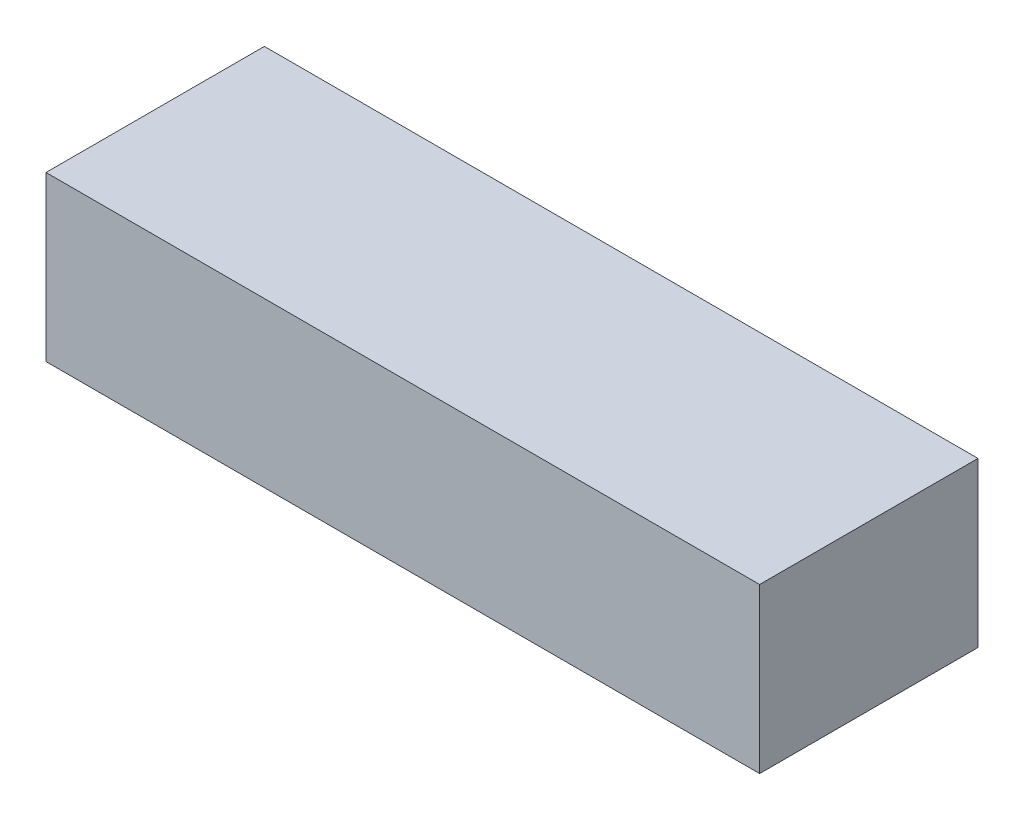
ISO-10303-21;
HEADER;
FILE_DESCRIPTION(('STEP AP214'),'2;1');
FILE_NAME('part.step','',(''),(''),'','','');
FILE_SCHEMA(('AUTOMOTIVE_DESIGN { 1 0 10303 214 1 1 1 1 }'));
ENDSEC;
DATA;
#1=APPLICATION_CONTEXT('core data for automotive mechanical design processes');
#2=APPLICATION_PROTOCOL_DEFINITION('international standard','automotive_design',2000,#1);
#3=PRODUCT_CONTEXT('',#1,'mechanical');
#4=PRODUCT('Part','Part','',(#3));
#5=PRODUCT_RELATED_PRODUCT_CATEGORY('part','',(#4));
#6=PRODUCT_DEFINITION_FORMATION('','',#4);
#7=PRODUCT_DEFINITION_CONTEXT('part definition',#1,'design');
#8=PRODUCT_DEFINITION('design','',#6,#7);
#9=PRODUCT_DEFINITION_SHAPE('','',#8);
#10=(LENGTH_UNIT() NAMED_UNIT(*) SI_UNIT(.MILLI.,.METRE.));
#11=(NAMED_UNIT(*) PLANE_ANGLE_UNIT() SI_UNIT($,.RADIAN.));
#12=(NAMED_UNIT(*) SI_UNIT($,.STERADIAN.) SOLID_ANGLE_UNIT());
#13=UNCERTAINTY_MEASURE_WITH_UNIT(LENGTH_MEASURE(1.E-05),#10,'distance_accuracy_value','');
#14=(GEOMETRIC_REPRESENTATION_CONTEXT(3) GLOBAL_UNCERTAINTY_ASSIGNED_CONTEXT((#13)) GLOBAL_UNIT_ASSIGNED_CONTEXT((#10,
#11,#12)) REPRESENTATION_CONTEXT('',''));
#15=CARTESIAN_POINT('',(0.,0.,0.));
#16=DIRECTION('',(0.,0.,1.));
#17=DIRECTION('',(1.,0.,0.));
#18=AXIS2_PLACEMENT_3D('',#15,#16,#17);
#19=CARTESIAN_POINT('',(-457.5,-210.,-280.));
#20=DIRECTION('',(-1.,0.,0.));
#21=DIRECTION('',(0.,0.,1.));
#22=AXIS2_PLACEMENT_3D('',#19,#20,#21);
#23=PLANE('',#22);
#24=DIRECTION('',(0.,0.,1.));
#25=VECTOR('',#24,1.);
#26=CARTESIAN_POINT('',(-457.5,0.,-280.));
#27=LINE('',#26,#25);
#28=CARTESIAN_POINT('',(-457.5,0.,-280.));
#29=VERTEX_POINT('',#28);
#30=CARTESIAN_POINT('',(-457.5,0.,0.));
#31=VERTEX_POINT('',#30);
#32=EDGE_CURVE('E96',#29,#31,#27,.T.);
#33=ORIENTED_EDGE('',*,*,#32,.F.);
#34=DIRECTION('',(0.,1.,0.));
#35=VECTOR('',#34,1.);
#36=CARTESIAN_POINT('',(-457.5,-210.,-280.));
#37=LINE('',#36,#35);
#38=CARTESIAN_POINT('',(-457.5,-210.,-280.));
#39=VERTEX_POINT('',#38);
#40=EDGE_CURVE('E11',#39,#29,#37,.T.);
#41=ORIENTED_EDGE('',*,*,#40,.F.);
#42=DIRECTION('',(0.,0.,1.));
#43=VECTOR('',#42,1.);
#44=CARTESIAN_POINT('',(-457.5,-210.,-280.));
#45=LINE('',#44,#43);
#46=CARTESIAN_POINT('',(-457.5,-210.,0.));
#47=VERTEX_POINT('',#46);
#48=EDGE_CURVE('E90',#39,#47,#45,.T.);
#49=ORIENTED_EDGE('',*,*,#48,.T.);
#50=DIRECTION('',(0.,1.,0.));
#51=VECTOR('',#50,1.);
#52=CARTESIAN_POINT('',(-457.5,-210.,0.));
#53=LINE('',#52,#51);
#54=EDGE_CURVE('E35',#47,#31,#53,.T.);
#55=ORIENTED_EDGE('',*,*,#54,.T.);
#56=EDGE_LOOP('',(#33,#41,#49,#55));
#57=FACE_BOUND('',#56,.T.);
#58=ADVANCED_FACE('F32',(#57),#23,.T.);
#59=CARTESIAN_POINT('',(-457.5,-210.,-280.));
#60=DIRECTION('',(0.,0.,-1.));
#61=DIRECTION('',(-1.,0.,0.));
#62=AXIS2_PLACEMENT_3D('',#59,#60,#61);
#63=PLANE('',#62);
#64=DIRECTION('',(-1.,0.,0.));
#65=VECTOR('',#64,1.);
#66=CARTESIAN_POINT('',(-457.5,0.,-280.));
#67=LINE('',#66,#65);
#68=CARTESIAN_POINT('',(457.5,0.,-280.));
#69=VERTEX_POINT('',#68);
#70=EDGE_CURVE('E92',#69,#29,#67,.T.);
#71=ORIENTED_EDGE('',*,*,#70,.F.);
#72=DIRECTION('',(0.,1.,0.));
#73=VECTOR('',#72,1.);
#74=CARTESIAN_POINT('',(457.5,-210.,-280.));
#75=LINE('',#74,#73);
#76=CARTESIAN_POINT('',(457.5,-210.,-280.));
#77=VERTEX_POINT('',#76);
#78=EDGE_CURVE('E41',#77,#69,#75,.T.);
#79=ORIENTED_EDGE('',*,*,#78,.F.);
#80=DIRECTION('',(-1.,0.,0.));
#81=VECTOR('',#80,1.);
#82=CARTESIAN_POINT('',(-457.5,-210.,-280.));
#83=LINE('',#82,#81);
#84=EDGE_CURVE('E87',#77,#39,#83,.T.);
#85=ORIENTED_EDGE('',*,*,#84,.T.);
#86=ORIENTED_EDGE('',*,*,#40,.T.);
#87=EDGE_LOOP('',(#71,#79,#85,#86));
#88=FACE_BOUND('',#87,.T.);
#89=ADVANCED_FACE('F106',(#88),#63,.T.);
#90=CARTESIAN_POINT('',(457.5,-210.,-280.));
#91=DIRECTION('',(1.,0.,0.));
#92=DIRECTION('',(0.,0.,-1.));
#93=AXIS2_PLACEMENT_3D('',#90,#91,#92);
#94=PLANE('',#93);
#95=DIRECTION('',(0.,0.,-1.));
#96=VECTOR('',#95,1.);
#97=CARTESIAN_POINT('',(457.5,0.,-280.));
#98=LINE('',#97,#96);
#99=CARTESIAN_POINT('',(457.5,0.,0.));
#100=VERTEX_POINT('',#99);
#101=EDGE_CURVE('E82',#100,#69,#98,.T.);
#102=ORIENTED_EDGE('',*,*,#101,.F.);
#103=DIRECTION('',(0.,1.,0.));
#104=VECTOR('',#103,1.);
#105=CARTESIAN_POINT('',(457.5,-210.,0.));
#106=LINE('',#105,#104);
#107=CARTESIAN_POINT('',(457.5,-210.,0.));
#108=VERTEX_POINT('',#107);
#109=EDGE_CURVE('E77',#108,#100,#106,.T.);
#110=ORIENTED_EDGE('',*,*,#109,.F.);
#111=DIRECTION('',(0.,0.,-1.));
#112=VECTOR('',#111,1.);
#113=CARTESIAN_POINT('',(457.5,-210.,-280.));
#114=LINE('',#113,#112);
#115=EDGE_CURVE('E80',#108,#77,#114,.T.);
#116=ORIENTED_EDGE('',*,*,#115,.T.);
#117=ORIENTED_EDGE('',*,*,#78,.T.);
#118=EDGE_LOOP('',(#102,#110,#116,#117));
#119=FACE_BOUND('',#118,.T.);
#120=ADVANCED_FACE('F79',(#119),#94,.T.);
#121=CARTESIAN_POINT('',(-457.5,-210.,0.));
#122=DIRECTION('',(0.,0.,1.));
#123=DIRECTION('',(1.,0.,0.));
#124=AXIS2_PLACEMENT_3D('',#121,#122,#123);
#125=PLANE('',#124);
#126=DIRECTION('',(1.,0.,0.));
#127=VECTOR('',#126,1.);
#128=CARTESIAN_POINT('',(-457.5,0.,0.));
#129=LINE('',#128,#127);
#130=EDGE_CURVE('E99',#31,#100,#129,.T.);
#131=ORIENTED_EDGE('',*,*,#130,.F.);
#132=ORIENTED_EDGE('',*,*,#54,.F.);
#133=DIRECTION('',(1.,0.,0.));
#134=VECTOR('',#133,1.);
#135=CARTESIAN_POINT('',(-457.5,-210.,0.));
#136=LINE('',#135,#134);
#137=EDGE_CURVE('E86',#47,#108,#136,.T.);
#138=ORIENTED_EDGE('',*,*,#137,.T.);
#139=ORIENTED_EDGE('',*,*,#109,.T.);
#140=EDGE_LOOP('',(#131,#132,#138,#139));
#141=FACE_BOUND('',#140,.T.);
#142=ADVANCED_FACE('F89',(#141),#125,.T.);
#143=CARTESIAN_POINT('',(0.,-210.,0.));
#144=DIRECTION('',(0.,1.,0.));
#145=DIRECTION('',(0.,0.,1.));
#146=AXIS2_PLACEMENT_3D('',#143,#144,#145);
#147=PLANE('',#146);
#148=ORIENTED_EDGE('',*,*,#48,.F.);
#149=ORIENTED_EDGE('',*,*,#84,.F.);
#150=ORIENTED_EDGE('',*,*,#115,.F.);
#151=ORIENTED_EDGE('',*,*,#137,.F.);
#152=EDGE_LOOP('',(#148,#149,#150,#151));
#153=FACE_BOUND('',#152,.T.);
#154=ADVANCED_FACE('F85',(#153),#147,.F.);
#155=CARTESIAN_POINT('',(0.,0.,0.));
#156=DIRECTION('',(0.,1.,0.));
#157=DIRECTION('',(0.,0.,1.));
#158=AXIS2_PLACEMENT_3D('',#155,#156,#157);
#159=PLANE('',#158);
#160=ORIENTED_EDGE('',*,*,#32,.T.);
#161=ORIENTED_EDGE('',*,*,#130,.T.);
#162=ORIENTED_EDGE('',*,*,#101,.T.);
#163=ORIENTED_EDGE('',*,*,#70,.T.);
#164=EDGE_LOOP('',(#160,#161,#162,#163));
#165=FACE_BOUND('',#164,.T.);
#166=ADVANCED_FACE('F105',(#165),#159,.T.);
#167=CLOSED_SHELL('',(#58,#89,#120,#142,#154,#166));
#168=MANIFOLD_SOLID_BREP('B2',#167);
#169=ADVANCED_BREP_SHAPE_REPRESENTATION('',(#18,#168),#14);
#170=SHAPE_DEFINITION_REPRESENTATION(#9,#169);
ENDSEC;
END-ISO-10303-21;
